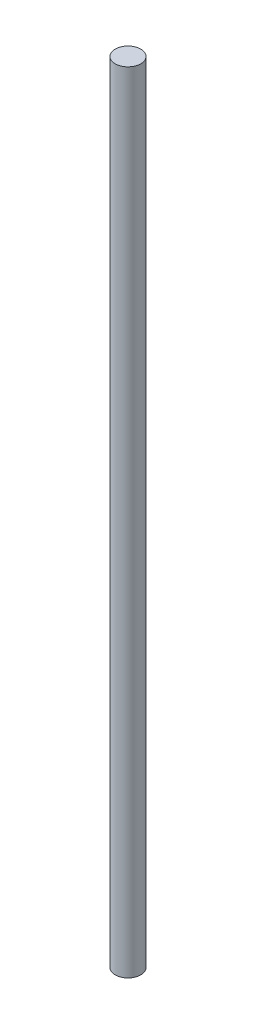
ISO-10303-21;
HEADER;
FILE_DESCRIPTION(('STEP AP214'),'2;1');
FILE_NAME('part.step','',(''),(''),'','','');
FILE_SCHEMA(('AUTOMOTIVE_DESIGN { 1 0 10303 214 1 1 1 1 }'));
ENDSEC;
DATA;
#1=APPLICATION_CONTEXT('core data for automotive mechanical design processes');
#2=APPLICATION_PROTOCOL_DEFINITION('international standard','automotive_design',2000,#1);
#3=PRODUCT_CONTEXT('',#1,'mechanical');
#4=PRODUCT('Part','Part','',(#3));
#5=PRODUCT_RELATED_PRODUCT_CATEGORY('part','',(#4));
#6=PRODUCT_DEFINITION_FORMATION('','',#4);
#7=PRODUCT_DEFINITION_CONTEXT('part definition',#1,'design');
#8=PRODUCT_DEFINITION('design','',#6,#7);
#9=PRODUCT_DEFINITION_SHAPE('','',#8);
#10=(LENGTH_UNIT() NAMED_UNIT(*) SI_UNIT(.MILLI.,.METRE.));
#11=(NAMED_UNIT(*) PLANE_ANGLE_UNIT() SI_UNIT($,.RADIAN.));
#12=(NAMED_UNIT(*) SI_UNIT($,.STERADIAN.) SOLID_ANGLE_UNIT());
#13=UNCERTAINTY_MEASURE_WITH_UNIT(LENGTH_MEASURE(1.E-05),#10,'distance_accuracy_value','');
#14=(GEOMETRIC_REPRESENTATION_CONTEXT(3) GLOBAL_UNCERTAINTY_ASSIGNED_CONTEXT((#13)) GLOBAL_UNIT_ASSIGNED_CONTEXT((#10,
#11,#12)) REPRESENTATION_CONTEXT('',''));
#15=CARTESIAN_POINT('',(0.,0.,0.));
#16=DIRECTION('',(0.,0.,1.));
#17=DIRECTION('',(1.,0.,0.));
#18=AXIS2_PLACEMENT_3D('',#15,#16,#17);
#19=CARTESIAN_POINT('',(0.,61.8,0.));
#20=DIRECTION('',(0.,-1.,0.));
#21=DIRECTION('',(0.,0.,-1.));
#22=AXIS2_PLACEMENT_3D('',#19,#20,#21);
#23=CYLINDRICAL_SURFACE('',#22,1.);
#24=CARTESIAN_POINT('',(0.,61.8,0.));
#25=DIRECTION('',(0.,1.,0.));
#26=DIRECTION('',(0.,0.,1.));
#27=AXIS2_PLACEMENT_3D('',#24,#25,#26);
#28=CIRCLE('',#27,1.);
#29=CARTESIAN_POINT('',(0.,61.8,1.));
#30=VERTEX_POINT('',#29);
#31=EDGE_CURVE('E10',#30,#30,#28,.T.);
#32=ORIENTED_EDGE('',*,*,#31,.F.);
#33=EDGE_LOOP('',(#32));
#34=FACE_BOUND('',#33,.T.);
#35=CARTESIAN_POINT('',(0.,0.,0.));
#36=DIRECTION('',(0.,1.,0.));
#37=DIRECTION('',(0.,0.,1.));
#38=AXIS2_PLACEMENT_3D('',#35,#36,#37);
#39=CIRCLE('',#38,1.);
#40=CARTESIAN_POINT('',(0.,0.,1.));
#41=VERTEX_POINT('',#40);
#42=EDGE_CURVE('E38',#41,#41,#39,.T.);
#43=ORIENTED_EDGE('',*,*,#42,.T.);
#44=EDGE_LOOP('',(#43));
#45=FACE_BOUND('',#44,.T.);
#46=ADVANCED_FACE('F35',(#34,#45),#23,.T.);
#47=CARTESIAN_POINT('',(0.,61.8,0.));
#48=DIRECTION('',(0.,1.,0.));
#49=DIRECTION('',(0.,0.,1.));
#50=AXIS2_PLACEMENT_3D('',#47,#48,#49);
#51=PLANE('',#50);
#52=ORIENTED_EDGE('',*,*,#31,.T.);
#53=EDGE_LOOP('',(#52));
#54=FACE_BOUND('',#53,.T.);
#55=ADVANCED_FACE('F50',(#54),#51,.T.);
#56=CARTESIAN_POINT('',(0.,0.,0.));
#57=DIRECTION('',(0.,1.,0.));
#58=DIRECTION('',(0.,0.,1.));
#59=AXIS2_PLACEMENT_3D('',#56,#57,#58);
#60=PLANE('',#59);
#61=ORIENTED_EDGE('',*,*,#42,.F.);
#62=EDGE_LOOP('',(#61));
#63=FACE_BOUND('',#62,.T.);
#64=ADVANCED_FACE('F48',(#63),#60,.F.);
#65=CLOSED_SHELL('',(#46,#55,#64));
#66=MANIFOLD_SOLID_BREP('B2',#65);
#67=ADVANCED_BREP_SHAPE_REPRESENTATION('',(#18,#66),#14);
#68=SHAPE_DEFINITION_REPRESENTATION(#9,#67);
ENDSEC;
END-ISO-10303-21;
